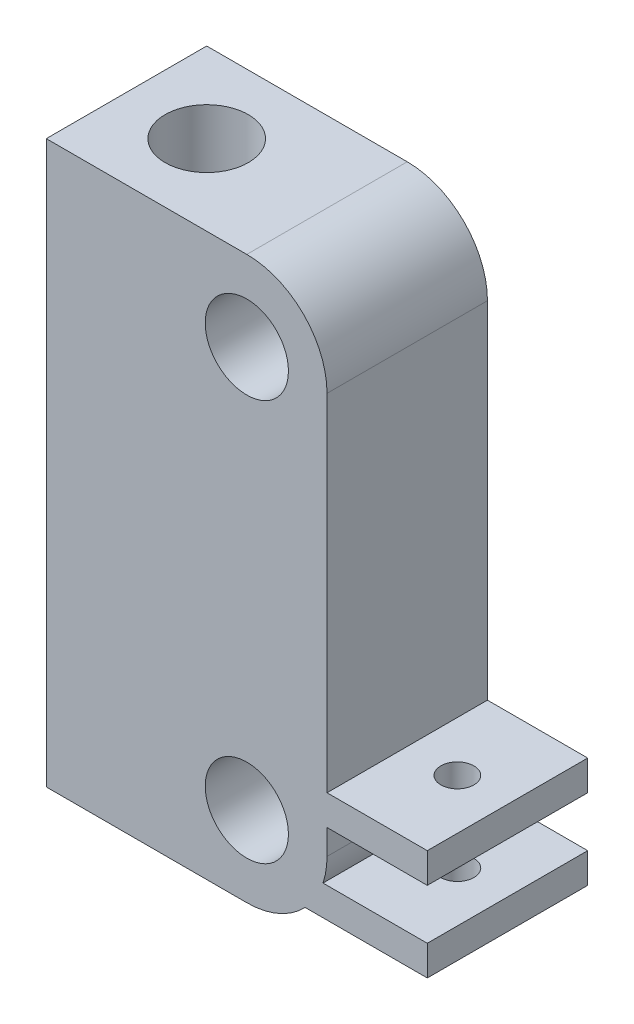
ISO-10303-21;
HEADER;
FILE_DESCRIPTION(('STEP AP214'),'2;1');
FILE_NAME('part.step','',(''),(''),'','','');
FILE_SCHEMA(('AUTOMOTIVE_DESIGN { 1 0 10303 214 1 1 1 1 }'));
ENDSEC;
DATA;
#1=APPLICATION_CONTEXT('core data for automotive mechanical design processes');
#2=APPLICATION_PROTOCOL_DEFINITION('international standard','automotive_design',2000,#1);
#3=PRODUCT_CONTEXT('',#1,'mechanical');
#4=PRODUCT('Part','Part','',(#3));
#5=PRODUCT_RELATED_PRODUCT_CATEGORY('part','',(#4));
#6=PRODUCT_DEFINITION_FORMATION('','',#4);
#7=PRODUCT_DEFINITION_CONTEXT('part definition',#1,'design');
#8=PRODUCT_DEFINITION('design','',#6,#7);
#9=PRODUCT_DEFINITION_SHAPE('','',#8);
#10=(LENGTH_UNIT() NAMED_UNIT(*) SI_UNIT(.MILLI.,.METRE.));
#11=(NAMED_UNIT(*) PLANE_ANGLE_UNIT() SI_UNIT($,.RADIAN.));
#12=(NAMED_UNIT(*) SI_UNIT($,.STERADIAN.) SOLID_ANGLE_UNIT());
#13=UNCERTAINTY_MEASURE_WITH_UNIT(LENGTH_MEASURE(1.E-05),#10,'distance_accuracy_value','');
#14=(GEOMETRIC_REPRESENTATION_CONTEXT(3) GLOBAL_UNCERTAINTY_ASSIGNED_CONTEXT((#13)) GLOBAL_UNIT_ASSIGNED_CONTEXT((#10,
#11,#12)) REPRESENTATION_CONTEXT('',''));
#15=CARTESIAN_POINT('',(0.,0.,0.));
#16=DIRECTION('',(0.,0.,1.));
#17=DIRECTION('',(1.,0.,0.));
#18=AXIS2_PLACEMENT_3D('',#15,#16,#17);
#19=CARTESIAN_POINT('',(-16.0580401373062,21.6311648945654,-16.));
#20=DIRECTION('',(-1.,0.,0.));
#21=DIRECTION('',(0.,-1.,0.));
#22=AXIS2_PLACEMENT_3D('',#19,#20,#21);
#23=PLANE('',#22);
#24=DIRECTION('',(0.,-1.,0.));
#25=VECTOR('',#24,1.);
#26=CARTESIAN_POINT('',(-16.0580401373062,21.6311648945654,0.));
#27=LINE('',#26,#25);
#28=CARTESIAN_POINT('',(-16.0580401373062,21.6311648945654,0.));
#29=VERTEX_POINT('',#28);
#30=CARTESIAN_POINT('',(-16.0580401373062,-34.3688351054346,0.));
#31=VERTEX_POINT('',#30);
#32=EDGE_CURVE('E167',#29,#31,#27,.T.);
#33=ORIENTED_EDGE('',*,*,#32,.F.);
#34=DIRECTION('',(0.,0.,1.));
#35=VECTOR('',#34,1.);
#36=CARTESIAN_POINT('',(-16.0580401373062,21.6311648945654,-16.));
#37=LINE('',#36,#35);
#38=CARTESIAN_POINT('',(-16.0580401373062,21.6311648945654,-16.));
#39=VERTEX_POINT('',#38);
#40=EDGE_CURVE('E11',#39,#29,#37,.T.);
#41=ORIENTED_EDGE('',*,*,#40,.F.);
#42=DIRECTION('',(0.,-1.,0.));
#43=VECTOR('',#42,1.);
#44=CARTESIAN_POINT('',(-16.0580401373062,21.6311648945654,-16.));
#45=LINE('',#44,#43);
#46=CARTESIAN_POINT('',(-16.0580401373062,-34.3688351054346,-16.));
#47=VERTEX_POINT('',#46);
#48=EDGE_CURVE('E206',#39,#47,#45,.T.);
#49=ORIENTED_EDGE('',*,*,#48,.T.);
#50=DIRECTION('',(0.,0.,1.));
#51=VECTOR('',#50,1.);
#52=CARTESIAN_POINT('',(-16.0580401373062,-34.3688351054346,-16.));
#53=LINE('',#52,#51);
#54=EDGE_CURVE('E107',#47,#31,#53,.T.);
#55=ORIENTED_EDGE('',*,*,#54,.T.);
#56=EDGE_LOOP('',(#33,#41,#49,#55));
#57=FACE_BOUND('',#56,.T.);
#58=ADVANCED_FACE('F33',(#57),#23,.T.);
#59=CARTESIAN_POINT('',(-16.0580401373062,21.6311648945654,-16.));
#60=DIRECTION('',(0.,1.,0.));
#61=DIRECTION('',(0.,0.,1.));
#62=AXIS2_PLACEMENT_3D('',#59,#60,#61);
#63=PLANE('',#62);
#64=CARTESIAN_POINT('',(-8.05804013730616,21.6311648945654,-8.));
#65=DIRECTION('',(0.,1.,0.));
#66=DIRECTION('',(0.,0.,1.));
#67=AXIS2_PLACEMENT_3D('',#64,#65,#66);
#68=CIRCLE('',#67,4.15);
#69=CARTESIAN_POINT('',(-8.05804013730616,21.6311648945654,-3.85));
#70=VERTEX_POINT('',#69);
#71=EDGE_CURVE('E292',#70,#70,#68,.T.);
#72=ORIENTED_EDGE('',*,*,#71,.F.);
#73=EDGE_LOOP('',(#72));
#74=FACE_BOUND('',#73,.T.);
#75=DIRECTION('',(-1.,0.,0.));
#76=VECTOR('',#75,1.);
#77=CARTESIAN_POINT('',(-16.0580401373062,21.6311648945654,0.));
#78=LINE('',#77,#76);
#79=CARTESIAN_POINT('',(3.94195986269384,21.6311648945654,0.));
#80=VERTEX_POINT('',#79);
#81=EDGE_CURVE('E204',#80,#29,#78,.T.);
#82=ORIENTED_EDGE('',*,*,#81,.F.);
#83=DIRECTION('',(0.,0.,1.));
#84=VECTOR('',#83,1.);
#85=CARTESIAN_POINT('',(3.94195986269384,21.6311648945654,-16.));
#86=LINE('',#85,#84);
#87=CARTESIAN_POINT('',(3.94195986269384,21.6311648945654,-16.));
#88=VERTEX_POINT('',#87);
#89=EDGE_CURVE('E42',#88,#80,#86,.T.);
#90=ORIENTED_EDGE('',*,*,#89,.F.);
#91=DIRECTION('',(-1.,0.,0.));
#92=VECTOR('',#91,1.);
#93=CARTESIAN_POINT('',(-16.0580401373062,21.6311648945654,-16.));
#94=LINE('',#93,#92);
#95=EDGE_CURVE('E157',#88,#39,#94,.T.);
#96=ORIENTED_EDGE('',*,*,#95,.T.);
#97=ORIENTED_EDGE('',*,*,#40,.T.);
#98=EDGE_LOOP('',(#82,#90,#96,#97));
#99=FACE_BOUND('',#98,.T.);
#100=ADVANCED_FACE('F231',(#74,#99),#63,.T.);
#101=CARTESIAN_POINT('',(3.94195986269384,13.6311648945654,-16.));
#102=DIRECTION('',(0.,0.,1.));
#103=DIRECTION('',(1.,0.,0.));
#104=AXIS2_PLACEMENT_3D('',#101,#102,#103);
#105=CYLINDRICAL_SURFACE('',#104,8.);
#106=CARTESIAN_POINT('',(3.94195986269384,13.6311648945654,0.));
#107=DIRECTION('',(0.,0.,1.));
#108=DIRECTION('',(-1.,0.,0.));
#109=AXIS2_PLACEMENT_3D('',#106,#107,#108);
#110=CIRCLE('',#109,8.);
#111=CARTESIAN_POINT('',(11.9419598626938,13.6311648945654,0.));
#112=VERTEX_POINT('',#111);
#113=EDGE_CURVE('E144',#112,#80,#110,.T.);
#114=ORIENTED_EDGE('',*,*,#113,.F.);
#115=DIRECTION('',(0.,0.,1.));
#116=VECTOR('',#115,1.);
#117=CARTESIAN_POINT('',(11.9419598626938,13.6311648945654,-16.));
#118=LINE('',#117,#116);
#119=CARTESIAN_POINT('',(11.9419598626938,13.6311648945654,-16.));
#120=VERTEX_POINT('',#119);
#121=EDGE_CURVE('E139',#120,#112,#118,.T.);
#122=ORIENTED_EDGE('',*,*,#121,.F.);
#123=CARTESIAN_POINT('',(3.94195986269384,13.6311648945654,-16.));
#124=DIRECTION('',(0.,0.,1.));
#125=DIRECTION('',(-1.,0.,0.));
#126=AXIS2_PLACEMENT_3D('',#123,#124,#125);
#127=CIRCLE('',#126,8.);
#128=EDGE_CURVE('E142',#120,#88,#127,.T.);
#129=ORIENTED_EDGE('',*,*,#128,.T.);
#130=ORIENTED_EDGE('',*,*,#89,.T.);
#131=EDGE_LOOP('',(#114,#122,#129,#130));
#132=FACE_BOUND('',#131,.T.);
#133=ADVANCED_FACE('F141',(#132),#105,.T.);
#134=CARTESIAN_POINT('',(11.9419598626938,13.6311648945654,-16.));
#135=DIRECTION('',(1.,0.,0.));
#136=DIRECTION('',(0.,1.,0.));
#137=AXIS2_PLACEMENT_3D('',#134,#135,#136);
#138=PLANE('',#137);
#139=DIRECTION('',(0.,1.,0.));
#140=VECTOR('',#139,1.);
#141=CARTESIAN_POINT('',(11.9419598626938,13.6311648945654,0.));
#142=LINE('',#141,#140);
#143=CARTESIAN_POINT('',(11.9419598626938,-20.8688351054346,0.));
#144=VERTEX_POINT('',#143);
#145=EDGE_CURVE('E201',#144,#112,#142,.T.);
#146=ORIENTED_EDGE('',*,*,#145,.F.);
#147=DIRECTION('',(0.,0.,1.));
#148=VECTOR('',#147,1.);
#149=CARTESIAN_POINT('',(11.9419598626938,-20.8688351054346,-16.));
#150=LINE('',#149,#148);
#151=CARTESIAN_POINT('',(11.9419598626938,-20.8688351054346,-16.));
#152=VERTEX_POINT('',#151);
#153=EDGE_CURVE('E149',#152,#144,#150,.T.);
#154=ORIENTED_EDGE('',*,*,#153,.F.);
#155=DIRECTION('',(0.,1.,0.));
#156=VECTOR('',#155,1.);
#157=CARTESIAN_POINT('',(11.9419598626938,13.6311648945654,-16.));
#158=LINE('',#157,#156);
#159=EDGE_CURVE('E155',#152,#120,#158,.T.);
#160=ORIENTED_EDGE('',*,*,#159,.T.);
#161=ORIENTED_EDGE('',*,*,#121,.T.);
#162=EDGE_LOOP('',(#146,#154,#160,#161));
#163=FACE_BOUND('',#162,.T.);
#164=ADVANCED_FACE('F159',(#163),#138,.T.);
#165=CARTESIAN_POINT('',(11.9419598626938,-20.8688351054346,-16.));
#166=DIRECTION('',(0.,1.,0.));
#167=DIRECTION('',(0.,0.,1.));
#168=AXIS2_PLACEMENT_3D('',#165,#166,#167);
#169=PLANE('',#168);
#170=CARTESIAN_POINT('',(16.9419598626938,-20.8688351054346,-8.));
#171=DIRECTION('',(0.,1.,0.));
#172=DIRECTION('',(0.,0.,1.));
#173=AXIS2_PLACEMENT_3D('',#170,#171,#172);
#174=CIRCLE('',#173,1.65);
#175=CARTESIAN_POINT('',(16.9419598626938,-20.8688351054346,-6.35));
#176=VERTEX_POINT('',#175);
#177=EDGE_CURVE('E392',#176,#176,#174,.T.);
#178=ORIENTED_EDGE('',*,*,#177,.F.);
#179=EDGE_LOOP('',(#178));
#180=FACE_BOUND('',#179,.T.);
#181=DIRECTION('',(-1.,0.,0.));
#182=VECTOR('',#181,1.);
#183=CARTESIAN_POINT('',(11.9419598626938,-20.8688351054346,0.));
#184=LINE('',#183,#182);
#185=CARTESIAN_POINT('',(21.9419598626938,-20.8688351054346,0.));
#186=VERTEX_POINT('',#185);
#187=EDGE_CURVE('E198',#186,#144,#184,.T.);
#188=ORIENTED_EDGE('',*,*,#187,.F.);
#189=DIRECTION('',(0.,0.,1.));
#190=VECTOR('',#189,1.);
#191=CARTESIAN_POINT('',(21.9419598626938,-20.8688351054346,-16.));
#192=LINE('',#191,#190);
#193=CARTESIAN_POINT('',(21.9419598626938,-20.8688351054346,-16.));
#194=VERTEX_POINT('',#193);
#195=EDGE_CURVE('E210',#194,#186,#192,.T.);
#196=ORIENTED_EDGE('',*,*,#195,.F.);
#197=DIRECTION('',(-1.,0.,0.));
#198=VECTOR('',#197,1.);
#199=CARTESIAN_POINT('',(11.9419598626938,-20.8688351054346,-16.));
#200=LINE('',#199,#198);
#201=EDGE_CURVE('E160',#194,#152,#200,.T.);
#202=ORIENTED_EDGE('',*,*,#201,.T.);
#203=ORIENTED_EDGE('',*,*,#153,.T.);
#204=EDGE_LOOP('',(#188,#196,#202,#203));
#205=FACE_BOUND('',#204,.T.);
#206=ADVANCED_FACE('F246',(#180,#205),#169,.T.);
#207=CARTESIAN_POINT('',(21.9419598626938,-20.8688351054346,-16.));
#208=DIRECTION('',(1.,0.,0.));
#209=DIRECTION('',(0.,1.,0.));
#210=AXIS2_PLACEMENT_3D('',#207,#208,#209);
#211=PLANE('',#210);
#212=DIRECTION('',(0.,1.,0.));
#213=VECTOR('',#212,1.);
#214=CARTESIAN_POINT('',(21.9419598626938,-20.8688351054346,0.));
#215=LINE('',#214,#213);
#216=CARTESIAN_POINT('',(21.9419598626938,-23.8688351054346,0.));
#217=VERTEX_POINT('',#216);
#218=EDGE_CURVE('E195',#217,#186,#215,.T.);
#219=ORIENTED_EDGE('',*,*,#218,.F.);
#220=DIRECTION('',(0.,0.,1.));
#221=VECTOR('',#220,1.);
#222=CARTESIAN_POINT('',(21.9419598626938,-23.8688351054346,-16.));
#223=LINE('',#222,#221);
#224=CARTESIAN_POINT('',(21.9419598626938,-23.8688351054346,-16.));
#225=VERTEX_POINT('',#224);
#226=EDGE_CURVE('E212',#225,#217,#223,.T.);
#227=ORIENTED_EDGE('',*,*,#226,.F.);
#228=DIRECTION('',(0.,1.,0.));
#229=VECTOR('',#228,1.);
#230=CARTESIAN_POINT('',(21.9419598626938,-20.8688351054346,-16.));
#231=LINE('',#230,#229);
#232=EDGE_CURVE('E162',#225,#194,#231,.T.);
#233=ORIENTED_EDGE('',*,*,#232,.T.);
#234=ORIENTED_EDGE('',*,*,#195,.T.);
#235=EDGE_LOOP('',(#219,#227,#233,#234));
#236=FACE_BOUND('',#235,.T.);
#237=ADVANCED_FACE('F249',(#236),#211,.T.);
#238=CARTESIAN_POINT('',(21.9419598626938,-23.8688351054346,-16.));
#239=DIRECTION('',(0.,-1.,0.));
#240=DIRECTION('',(0.,0.,-1.));
#241=AXIS2_PLACEMENT_3D('',#238,#239,#240);
#242=PLANE('',#241);
#243=CARTESIAN_POINT('',(16.9419598626938,-23.8688351054346,-8.));
#244=DIRECTION('',(0.,-1.,0.));
#245=DIRECTION('',(0.,0.,-1.));
#246=AXIS2_PLACEMENT_3D('',#243,#244,#245);
#247=CIRCLE('',#246,1.65);
#248=CARTESIAN_POINT('',(16.9419598626938,-23.8688351054346,-9.65));
#249=VERTEX_POINT('',#248);
#250=EDGE_CURVE('E298',#249,#249,#247,.T.);
#251=ORIENTED_EDGE('',*,*,#250,.F.);
#252=EDGE_LOOP('',(#251));
#253=FACE_BOUND('',#252,.T.);
#254=DIRECTION('',(1.,0.,0.));
#255=VECTOR('',#254,1.);
#256=CARTESIAN_POINT('',(21.9419598626938,-23.8688351054346,0.));
#257=LINE('',#256,#255);
#258=CARTESIAN_POINT('',(11.9419598626938,-23.8688351054346,0.));
#259=VERTEX_POINT('',#258);
#260=EDGE_CURVE('E192',#259,#217,#257,.T.);
#261=ORIENTED_EDGE('',*,*,#260,.F.);
#262=DIRECTION('',(0.,0.,1.));
#263=VECTOR('',#262,1.);
#264=CARTESIAN_POINT('',(11.9419598626938,-23.8688351054346,-16.));
#265=LINE('',#264,#263);
#266=CARTESIAN_POINT('',(11.9419598626938,-23.8688351054346,-16.));
#267=VERTEX_POINT('',#266);
#268=EDGE_CURVE('E214',#267,#259,#265,.T.);
#269=ORIENTED_EDGE('',*,*,#268,.F.);
#270=DIRECTION('',(1.,0.,0.));
#271=VECTOR('',#270,1.);
#272=CARTESIAN_POINT('',(21.9419598626938,-23.8688351054346,-16.));
#273=LINE('',#272,#271);
#274=EDGE_CURVE('E331',#267,#225,#273,.T.);
#275=ORIENTED_EDGE('',*,*,#274,.T.);
#276=ORIENTED_EDGE('',*,*,#226,.T.);
#277=EDGE_LOOP('',(#261,#269,#275,#276));
#278=FACE_BOUND('',#277,.T.);
#279=ADVANCED_FACE('F253',(#253,#278),#242,.T.);
#280=CARTESIAN_POINT('',(11.9419598626938,-23.8688351054346,-16.));
#281=DIRECTION('',(1.,0.,0.));
#282=DIRECTION('',(0.,1.,0.));
#283=AXIS2_PLACEMENT_3D('',#280,#281,#282);
#284=PLANE('',#283);
#285=DIRECTION('',(0.,1.,0.));
#286=VECTOR('',#285,1.);
#287=CARTESIAN_POINT('',(11.9419598626938,-23.8688351054346,0.));
#288=LINE('',#287,#286);
#289=CARTESIAN_POINT('',(11.9419598626938,-26.3688351054346,0.));
#290=VERTEX_POINT('',#289);
#291=EDGE_CURVE('E189',#290,#259,#288,.T.);
#292=ORIENTED_EDGE('',*,*,#291,.F.);
#293=DIRECTION('',(0.,0.,1.));
#294=VECTOR('',#293,1.);
#295=CARTESIAN_POINT('',(11.9419598626938,-26.3688351054346,-16.));
#296=LINE('',#295,#294);
#297=CARTESIAN_POINT('',(11.9419598626938,-26.3688351054346,-16.));
#298=VERTEX_POINT('',#297);
#299=EDGE_CURVE('E216',#298,#290,#296,.T.);
#300=ORIENTED_EDGE('',*,*,#299,.F.);
#301=DIRECTION('',(0.,1.,0.));
#302=VECTOR('',#301,1.);
#303=CARTESIAN_POINT('',(11.9419598626938,-23.8688351054346,-16.));
#304=LINE('',#303,#302);
#305=EDGE_CURVE('E328',#298,#267,#304,.T.);
#306=ORIENTED_EDGE('',*,*,#305,.T.);
#307=ORIENTED_EDGE('',*,*,#268,.T.);
#308=EDGE_LOOP('',(#292,#300,#306,#307));
#309=FACE_BOUND('',#308,.T.);
#310=ADVANCED_FACE('F257',(#309),#284,.T.);
#311=CARTESIAN_POINT('',(3.94195986269385,-26.3688351054346,-16.));
#312=DIRECTION('',(0.,0.,1.));
#313=DIRECTION('',(1.,0.,0.));
#314=AXIS2_PLACEMENT_3D('',#311,#312,#313);
#315=CYLINDRICAL_SURFACE('',#314,8.);
#316=CARTESIAN_POINT('',(3.94195986269385,-26.3688351054346,0.));
#317=DIRECTION('',(0.,0.,1.));
#318=DIRECTION('',(1.,0.,0.));
#319=AXIS2_PLACEMENT_3D('',#316,#317,#318);
#320=CIRCLE('',#319,8.);
#321=CARTESIAN_POINT('',(11.5413019394792,-28.8688351054346,0.));
#322=VERTEX_POINT('',#321);
#323=EDGE_CURVE('E186',#322,#290,#320,.T.);
#324=ORIENTED_EDGE('',*,*,#323,.F.);
#325=DIRECTION('',(0.,0.,1.));
#326=VECTOR('',#325,1.);
#327=CARTESIAN_POINT('',(11.5413019394792,-28.8688351054346,-16.));
#328=LINE('',#327,#326);
#329=CARTESIAN_POINT('',(11.5413019394792,-28.8688351054346,-16.));
#330=VERTEX_POINT('',#329);
#331=EDGE_CURVE('E218',#330,#322,#328,.T.);
#332=ORIENTED_EDGE('',*,*,#331,.F.);
#333=CARTESIAN_POINT('',(3.94195986269385,-26.3688351054346,-16.));
#334=DIRECTION('',(0.,0.,1.));
#335=DIRECTION('',(1.,0.,0.));
#336=AXIS2_PLACEMENT_3D('',#333,#334,#335);
#337=CIRCLE('',#336,8.);
#338=EDGE_CURVE('E325',#330,#298,#337,.T.);
#339=ORIENTED_EDGE('',*,*,#338,.T.);
#340=ORIENTED_EDGE('',*,*,#299,.T.);
#341=EDGE_LOOP('',(#324,#332,#339,#340));
#342=FACE_BOUND('',#341,.T.);
#343=ADVANCED_FACE('F261',(#342),#315,.T.);
#344=CARTESIAN_POINT('',(21.9419598626938,-28.8688351054346,-16.));
#345=DIRECTION('',(0.,1.,0.));
#346=DIRECTION('',(0.,0.,1.));
#347=AXIS2_PLACEMENT_3D('',#344,#345,#346);
#348=PLANE('',#347);
#349=CARTESIAN_POINT('',(16.9419598626938,-28.8688351054346,-8.));
#350=DIRECTION('',(0.,1.,0.));
#351=DIRECTION('',(0.,0.,1.));
#352=AXIS2_PLACEMENT_3D('',#349,#350,#351);
#353=CIRCLE('',#352,1.65);
#354=CARTESIAN_POINT('',(16.9419598626938,-28.8688351054346,-6.35));
#355=VERTEX_POINT('',#354);
#356=EDGE_CURVE('E389',#355,#355,#353,.T.);
#357=ORIENTED_EDGE('',*,*,#356,.F.);
#358=EDGE_LOOP('',(#357));
#359=FACE_BOUND('',#358,.T.);
#360=DIRECTION('',(-1.,0.,0.));
#361=VECTOR('',#360,1.);
#362=CARTESIAN_POINT('',(21.9419598626938,-28.8688351054346,0.));
#363=LINE('',#362,#361);
#364=CARTESIAN_POINT('',(21.9419598626938,-28.8688351054346,0.));
#365=VERTEX_POINT('',#364);
#366=EDGE_CURVE('E183',#365,#322,#363,.T.);
#367=ORIENTED_EDGE('',*,*,#366,.F.);
#368=DIRECTION('',(0.,0.,1.));
#369=VECTOR('',#368,1.);
#370=CARTESIAN_POINT('',(21.9419598626938,-28.8688351054346,-16.));
#371=LINE('',#370,#369);
#372=CARTESIAN_POINT('',(21.9419598626938,-28.8688351054346,-16.));
#373=VERTEX_POINT('',#372);
#374=EDGE_CURVE('E220',#373,#365,#371,.T.);
#375=ORIENTED_EDGE('',*,*,#374,.F.);
#376=DIRECTION('',(-1.,0.,0.));
#377=VECTOR('',#376,1.);
#378=CARTESIAN_POINT('',(21.9419598626938,-28.8688351054346,-16.));
#379=LINE('',#378,#377);
#380=EDGE_CURVE('E322',#373,#330,#379,.T.);
#381=ORIENTED_EDGE('',*,*,#380,.T.);
#382=ORIENTED_EDGE('',*,*,#331,.T.);
#383=EDGE_LOOP('',(#367,#375,#381,#382));
#384=FACE_BOUND('',#383,.T.);
#385=ADVANCED_FACE('F265',(#359,#384),#348,.T.);
#386=CARTESIAN_POINT('',(21.9419598626938,-31.8688351054346,-16.));
#387=DIRECTION('',(1.,0.,0.));
#388=DIRECTION('',(0.,0.,-1.));
#389=AXIS2_PLACEMENT_3D('',#386,#387,#388);
#390=PLANE('',#389);
#391=DIRECTION('',(0.,1.,0.));
#392=VECTOR('',#391,1.);
#393=CARTESIAN_POINT('',(21.9419598626938,-31.8688351054346,0.));
#394=LINE('',#393,#392);
#395=CARTESIAN_POINT('',(21.9419598626938,-31.8688351054346,0.));
#396=VERTEX_POINT('',#395);
#397=EDGE_CURVE('E180',#396,#365,#394,.T.);
#398=ORIENTED_EDGE('',*,*,#397,.F.);
#399=DIRECTION('',(0.,0.,1.));
#400=VECTOR('',#399,1.);
#401=CARTESIAN_POINT('',(21.9419598626938,-31.8688351054346,-16.));
#402=LINE('',#401,#400);
#403=CARTESIAN_POINT('',(21.9419598626938,-31.8688351054346,-16.));
#404=VERTEX_POINT('',#403);
#405=EDGE_CURVE('E222',#404,#396,#402,.T.);
#406=ORIENTED_EDGE('',*,*,#405,.F.);
#407=DIRECTION('',(0.,1.,0.));
#408=VECTOR('',#407,1.);
#409=CARTESIAN_POINT('',(21.9419598626938,-31.8688351054346,-16.));
#410=LINE('',#409,#408);
#411=EDGE_CURVE('E319',#404,#373,#410,.T.);
#412=ORIENTED_EDGE('',*,*,#411,.T.);
#413=ORIENTED_EDGE('',*,*,#374,.T.);
#414=EDGE_LOOP('',(#398,#406,#412,#413));
#415=FACE_BOUND('',#414,.T.);
#416=ADVANCED_FACE('F269',(#415),#390,.T.);
#417=CARTESIAN_POINT('',(9.75143488200497,-31.8688351054346,-16.));
#418=DIRECTION('',(0.,-1.,0.));
#419=DIRECTION('',(1.,0.,0.));
#420=AXIS2_PLACEMENT_3D('',#417,#418,#419);
#421=PLANE('',#420);
#422=CARTESIAN_POINT('',(16.9419598626938,-31.8688351054346,-8.));
#423=DIRECTION('',(0.,-1.,0.));
#424=DIRECTION('',(1.,0.,0.));
#425=AXIS2_PLACEMENT_3D('',#422,#423,#424);
#426=CIRCLE('',#425,1.65);
#427=CARTESIAN_POINT('',(18.5919598626938,-31.8688351054346,-8.));
#428=VERTEX_POINT('',#427);
#429=EDGE_CURVE('E36',#428,#428,#426,.T.);
#430=ORIENTED_EDGE('',*,*,#429,.F.);
#431=EDGE_LOOP('',(#430));
#432=FACE_BOUND('',#431,.T.);
#433=DIRECTION('',(1.,0.,0.));
#434=VECTOR('',#433,1.);
#435=CARTESIAN_POINT('',(9.75143488200497,-31.8688351054346,0.));
#436=LINE('',#435,#434);
#437=CARTESIAN_POINT('',(9.75143488200497,-31.8688351054346,0.));
#438=VERTEX_POINT('',#437);
#439=EDGE_CURVE('E177',#438,#396,#436,.T.);
#440=ORIENTED_EDGE('',*,*,#439,.F.);
#441=DIRECTION('',(0.,0.,1.));
#442=VECTOR('',#441,1.);
#443=CARTESIAN_POINT('',(9.75143488200497,-31.8688351054346,-16.));
#444=LINE('',#443,#442);
#445=CARTESIAN_POINT('',(9.75143488200497,-31.8688351054346,-16.));
#446=VERTEX_POINT('',#445);
#447=EDGE_CURVE('E224',#446,#438,#444,.T.);
#448=ORIENTED_EDGE('',*,*,#447,.F.);
#449=DIRECTION('',(1.,0.,0.));
#450=VECTOR('',#449,1.);
#451=CARTESIAN_POINT('',(9.75143488200497,-31.8688351054346,-16.));
#452=LINE('',#451,#450);
#453=EDGE_CURVE('E316',#446,#404,#452,.T.);
#454=ORIENTED_EDGE('',*,*,#453,.T.);
#455=ORIENTED_EDGE('',*,*,#405,.T.);
#456=EDGE_LOOP('',(#440,#448,#454,#455));
#457=FACE_BOUND('',#456,.T.);
#458=ADVANCED_FACE('F273',(#432,#457),#421,.T.);
#459=CARTESIAN_POINT('',(3.94195986269385,-26.3688351054346,-16.));
#460=DIRECTION('',(0.,0.,1.));
#461=DIRECTION('',(1.,0.,0.));
#462=AXIS2_PLACEMENT_3D('',#459,#460,#461);
#463=CYLINDRICAL_SURFACE('',#462,8.);
#464=CARTESIAN_POINT('',(3.94195986269385,-26.3688351054346,0.));
#465=DIRECTION('',(0.,0.,1.));
#466=DIRECTION('',(1.,0.,0.));
#467=AXIS2_PLACEMENT_3D('',#464,#465,#466);
#468=CIRCLE('',#467,8.);
#469=CARTESIAN_POINT('',(3.94195986269384,-34.3688351054346,0.));
#470=VERTEX_POINT('',#469);
#471=EDGE_CURVE('E174',#470,#438,#468,.T.);
#472=ORIENTED_EDGE('',*,*,#471,.F.);
#473=DIRECTION('',(0.,0.,1.));
#474=VECTOR('',#473,1.);
#475=CARTESIAN_POINT('',(3.94195986269384,-34.3688351054346,-16.));
#476=LINE('',#475,#474);
#477=CARTESIAN_POINT('',(3.94195986269384,-34.3688351054346,-16.));
#478=VERTEX_POINT('',#477);
#479=EDGE_CURVE('E226',#478,#470,#476,.T.);
#480=ORIENTED_EDGE('',*,*,#479,.F.);
#481=CARTESIAN_POINT('',(3.94195986269385,-26.3688351054346,-16.));
#482=DIRECTION('',(0.,0.,1.));
#483=DIRECTION('',(1.,0.,0.));
#484=AXIS2_PLACEMENT_3D('',#481,#482,#483);
#485=CIRCLE('',#484,8.);
#486=EDGE_CURVE('E313',#478,#446,#485,.T.);
#487=ORIENTED_EDGE('',*,*,#486,.T.);
#488=ORIENTED_EDGE('',*,*,#447,.T.);
#489=EDGE_LOOP('',(#472,#480,#487,#488));
#490=FACE_BOUND('',#489,.T.);
#491=ADVANCED_FACE('F277',(#490),#463,.T.);
#492=CARTESIAN_POINT('',(-16.0580401373062,-34.3688351054346,-16.));
#493=DIRECTION('',(0.,-1.,0.));
#494=DIRECTION('',(0.,0.,-1.));
#495=AXIS2_PLACEMENT_3D('',#492,#493,#494);
#496=PLANE('',#495);
#497=CARTESIAN_POINT('',(-8.05804013730616,-34.3688351054346,-8.));
#498=DIRECTION('',(0.,1.,0.));
#499=DIRECTION('',(0.,0.,1.));
#500=AXIS2_PLACEMENT_3D('',#497,#498,#499);
#501=CIRCLE('',#500,4.15);
#502=CARTESIAN_POINT('',(-8.05804013730616,-34.3688351054346,-3.85));
#503=VERTEX_POINT('',#502);
#504=EDGE_CURVE('E289',#503,#503,#501,.T.);
#505=ORIENTED_EDGE('',*,*,#504,.T.);
#506=EDGE_LOOP('',(#505));
#507=FACE_BOUND('',#506,.T.);
#508=DIRECTION('',(1.,0.,0.));
#509=VECTOR('',#508,1.);
#510=CARTESIAN_POINT('',(-16.0580401373062,-34.3688351054346,0.));
#511=LINE('',#510,#509);
#512=EDGE_CURVE('E170',#31,#470,#511,.T.);
#513=ORIENTED_EDGE('',*,*,#512,.F.);
#514=ORIENTED_EDGE('',*,*,#54,.F.);
#515=DIRECTION('',(1.,0.,0.));
#516=VECTOR('',#515,1.);
#517=CARTESIAN_POINT('',(-16.0580401373062,-34.3688351054346,-16.));
#518=LINE('',#517,#516);
#519=EDGE_CURVE('E311',#47,#478,#518,.T.);
#520=ORIENTED_EDGE('',*,*,#519,.T.);
#521=ORIENTED_EDGE('',*,*,#479,.T.);
#522=EDGE_LOOP('',(#513,#514,#520,#521));
#523=FACE_BOUND('',#522,.T.);
#524=ADVANCED_FACE('F227',(#507,#523),#496,.T.);
#525=CARTESIAN_POINT('',(3.94195986269385,-26.3688351054346,-16.));
#526=DIRECTION('',(0.,0.,1.));
#527=DIRECTION('',(1.,0.,0.));
#528=AXIS2_PLACEMENT_3D('',#525,#526,#527);
#529=PLANE('',#528);
#530=CARTESIAN_POINT('',(3.94195986269385,-26.3688351054346,-16.));
#531=DIRECTION('',(0.,0.,1.));
#532=DIRECTION('',(1.,0.,0.));
#533=AXIS2_PLACEMENT_3D('',#530,#531,#532);
#534=CIRCLE('',#533,4.15);
#535=CARTESIAN_POINT('',(8.09195986269385,-26.3688351054346,-16.));
#536=VERTEX_POINT('',#535);
#537=EDGE_CURVE('E295',#536,#536,#534,.T.);
#538=ORIENTED_EDGE('',*,*,#537,.T.);
#539=EDGE_LOOP('',(#538));
#540=FACE_BOUND('',#539,.T.);
#541=CARTESIAN_POINT('',(3.94195986269384,13.6311648945654,-16.));
#542=DIRECTION('',(0.,0.,1.));
#543=DIRECTION('',(1.,0.,0.));
#544=AXIS2_PLACEMENT_3D('',#541,#542,#543);
#545=CIRCLE('',#544,4.15);
#546=CARTESIAN_POINT('',(8.09195986269384,13.6311648945654,-16.));
#547=VERTEX_POINT('',#546);
#548=EDGE_CURVE('E171',#547,#547,#545,.T.);
#549=ORIENTED_EDGE('',*,*,#548,.T.);
#550=EDGE_LOOP('',(#549));
#551=FACE_BOUND('',#550,.T.);
#552=ORIENTED_EDGE('',*,*,#48,.F.);
#553=ORIENTED_EDGE('',*,*,#95,.F.);
#554=ORIENTED_EDGE('',*,*,#128,.F.);
#555=ORIENTED_EDGE('',*,*,#159,.F.);
#556=ORIENTED_EDGE('',*,*,#201,.F.);
#557=ORIENTED_EDGE('',*,*,#232,.F.);
#558=ORIENTED_EDGE('',*,*,#274,.F.);
#559=ORIENTED_EDGE('',*,*,#305,.F.);
#560=ORIENTED_EDGE('',*,*,#338,.F.);
#561=ORIENTED_EDGE('',*,*,#380,.F.);
#562=ORIENTED_EDGE('',*,*,#411,.F.);
#563=ORIENTED_EDGE('',*,*,#453,.F.);
#564=ORIENTED_EDGE('',*,*,#486,.F.);
#565=ORIENTED_EDGE('',*,*,#519,.F.);
#566=EDGE_LOOP('',(#552,#553,#554,#555,#556,#557,#558,#559,#560,#561,#562,#563,#564,#565));
#567=FACE_BOUND('',#566,.T.);
#568=ADVANCED_FACE('F153',(#540,#551,#567),#529,.F.);
#569=CARTESIAN_POINT('',(3.94195986269385,-26.3688351054346,0.));
#570=DIRECTION('',(0.,0.,1.));
#571=DIRECTION('',(1.,0.,0.));
#572=AXIS2_PLACEMENT_3D('',#569,#570,#571);
#573=PLANE('',#572);
#574=CARTESIAN_POINT('',(3.94195986269385,-26.3688351054346,0.));
#575=DIRECTION('',(0.,0.,1.));
#576=DIRECTION('',(1.,0.,0.));
#577=AXIS2_PLACEMENT_3D('',#574,#575,#576);
#578=CIRCLE('',#577,4.15);
#579=CARTESIAN_POINT('',(8.09195986269385,-26.3688351054346,0.));
#580=VERTEX_POINT('',#579);
#581=EDGE_CURVE('E291',#580,#580,#578,.T.);
#582=ORIENTED_EDGE('',*,*,#581,.F.);
#583=EDGE_LOOP('',(#582));
#584=FACE_BOUND('',#583,.T.);
#585=CARTESIAN_POINT('',(3.94195986269384,13.6311648945654,0.));
#586=DIRECTION('',(0.,0.,1.));
#587=DIRECTION('',(1.,0.,0.));
#588=AXIS2_PLACEMENT_3D('',#585,#586,#587);
#589=CIRCLE('',#588,4.15);
#590=CARTESIAN_POINT('',(8.09195986269384,13.6311648945654,0.));
#591=VERTEX_POINT('',#590);
#592=EDGE_CURVE('E304',#591,#591,#589,.T.);
#593=ORIENTED_EDGE('',*,*,#592,.F.);
#594=EDGE_LOOP('',(#593));
#595=FACE_BOUND('',#594,.T.);
#596=ORIENTED_EDGE('',*,*,#32,.T.);
#597=ORIENTED_EDGE('',*,*,#512,.T.);
#598=ORIENTED_EDGE('',*,*,#471,.T.);
#599=ORIENTED_EDGE('',*,*,#439,.T.);
#600=ORIENTED_EDGE('',*,*,#397,.T.);
#601=ORIENTED_EDGE('',*,*,#366,.T.);
#602=ORIENTED_EDGE('',*,*,#323,.T.);
#603=ORIENTED_EDGE('',*,*,#291,.T.);
#604=ORIENTED_EDGE('',*,*,#260,.T.);
#605=ORIENTED_EDGE('',*,*,#218,.T.);
#606=ORIENTED_EDGE('',*,*,#187,.T.);
#607=ORIENTED_EDGE('',*,*,#145,.T.);
#608=ORIENTED_EDGE('',*,*,#113,.T.);
#609=ORIENTED_EDGE('',*,*,#81,.T.);
#610=EDGE_LOOP('',(#596,#597,#598,#599,#600,#601,#602,#603,#604,#605,#606,#607,#608,#609));
#611=FACE_BOUND('',#610,.T.);
#612=ADVANCED_FACE('F230',(#584,#595,#611),#573,.T.);
#613=CARTESIAN_POINT('',(3.94195986269384,13.6311648945654,-16.));
#614=DIRECTION('',(0.,0.,1.));
#615=DIRECTION('',(1.,0.,0.));
#616=AXIS2_PLACEMENT_3D('',#613,#614,#615);
#617=CYLINDRICAL_SURFACE('',#616,4.15);
#618=ORIENTED_EDGE('',*,*,#548,.F.);
#619=EDGE_LOOP('',(#618));
#620=FACE_BOUND('',#619,.T.);
#621=ORIENTED_EDGE('',*,*,#592,.T.);
#622=EDGE_LOOP('',(#621));
#623=FACE_BOUND('',#622,.T.);
#624=ADVANCED_FACE('F356',(#620,#623),#617,.F.);
#625=CARTESIAN_POINT('',(3.94195986269385,-26.3688351054346,-16.));
#626=DIRECTION('',(0.,0.,1.));
#627=DIRECTION('',(1.,0.,0.));
#628=AXIS2_PLACEMENT_3D('',#625,#626,#627);
#629=CYLINDRICAL_SURFACE('',#628,4.15);
#630=ORIENTED_EDGE('',*,*,#537,.F.);
#631=EDGE_LOOP('',(#630));
#632=FACE_BOUND('',#631,.T.);
#633=ORIENTED_EDGE('',*,*,#581,.T.);
#634=EDGE_LOOP('',(#633));
#635=FACE_BOUND('',#634,.T.);
#636=ADVANCED_FACE('F363',(#632,#635),#629,.F.);
#637=CARTESIAN_POINT('',(-8.05804013730616,-34.3688351054346,-8.));
#638=DIRECTION('',(0.,1.,0.));
#639=DIRECTION('',(0.,0.,1.));
#640=AXIS2_PLACEMENT_3D('',#637,#638,#639);
#641=CYLINDRICAL_SURFACE('',#640,4.15);
#642=ORIENTED_EDGE('',*,*,#504,.F.);
#643=EDGE_LOOP('',(#642));
#644=FACE_BOUND('',#643,.T.);
#645=ORIENTED_EDGE('',*,*,#71,.T.);
#646=EDGE_LOOP('',(#645));
#647=FACE_BOUND('',#646,.T.);
#648=ADVANCED_FACE('F369',(#644,#647),#641,.F.);
#649=CARTESIAN_POINT('',(16.9419598626938,-34.3688351054346,-8.));
#650=DIRECTION('',(0.,1.,0.));
#651=DIRECTION('',(0.,0.,1.));
#652=AXIS2_PLACEMENT_3D('',#649,#650,#651);
#653=CYLINDRICAL_SURFACE('',#652,1.65);
#654=ORIENTED_EDGE('',*,*,#356,.T.);
#655=EDGE_LOOP('',(#654));
#656=FACE_BOUND('',#655,.T.);
#657=ORIENTED_EDGE('',*,*,#429,.T.);
#658=EDGE_LOOP('',(#657));
#659=FACE_BOUND('',#658,.T.);
#660=ADVANCED_FACE('F375',(#656,#659),#653,.F.);
#661=ORIENTED_EDGE('',*,*,#250,.T.);
#662=EDGE_LOOP('',(#661));
#663=FACE_BOUND('',#662,.T.);
#664=ORIENTED_EDGE('',*,*,#177,.T.);
#665=EDGE_LOOP('',(#664));
#666=FACE_BOUND('',#665,.T.);
#667=ADVANCED_FACE('F380',(#663,#666),#653,.F.);
#668=CLOSED_SHELL('',(#58,#100,#133,#164,#206,#237,#279,#310,#343,#385,#416,#458,#491,#524,#568,
#612,#624,#636,#648,#660,#667));
#669=MANIFOLD_SOLID_BREP('B2',#668);
#670=ADVANCED_BREP_SHAPE_REPRESENTATION('',(#18,#669),#14);
#671=SHAPE_DEFINITION_REPRESENTATION(#9,#670);
ENDSEC;
END-ISO-10303-21;
